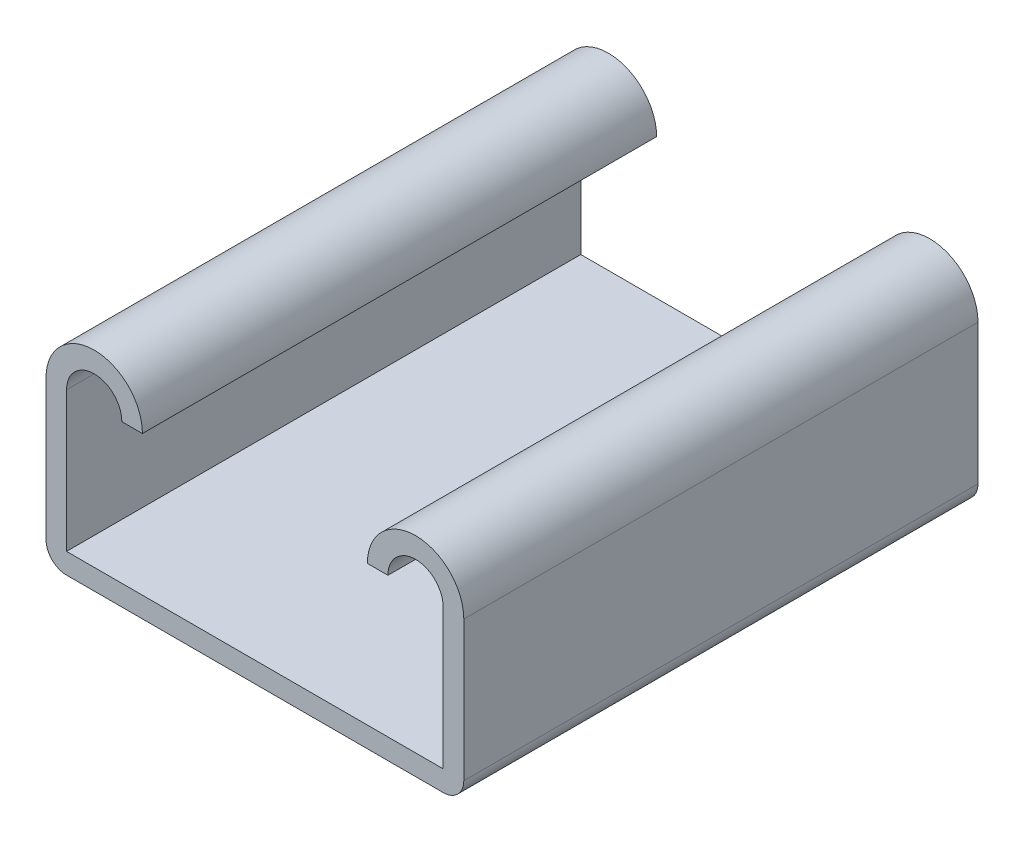
ISO-10303-21;
HEADER;
FILE_DESCRIPTION(('STEP AP214'),'2;1');
FILE_NAME('part.step','',(''),(''),'','','');
FILE_SCHEMA(('AUTOMOTIVE_DESIGN { 1 0 10303 214 1 1 1 1 }'));
ENDSEC;
DATA;
#1=APPLICATION_CONTEXT('core data for automotive mechanical design processes');
#2=APPLICATION_PROTOCOL_DEFINITION('international standard','automotive_design',2000,#1);
#3=PRODUCT_CONTEXT('',#1,'mechanical');
#4=PRODUCT('Part','Part','',(#3));
#5=PRODUCT_RELATED_PRODUCT_CATEGORY('part','',(#4));
#6=PRODUCT_DEFINITION_FORMATION('','',#4);
#7=PRODUCT_DEFINITION_CONTEXT('part definition',#1,'design');
#8=PRODUCT_DEFINITION('design','',#6,#7);
#9=PRODUCT_DEFINITION_SHAPE('','',#8);
#10=(LENGTH_UNIT() NAMED_UNIT(*) SI_UNIT(.MILLI.,.METRE.));
#11=(NAMED_UNIT(*) PLANE_ANGLE_UNIT() SI_UNIT($,.RADIAN.));
#12=(NAMED_UNIT(*) SI_UNIT($,.STERADIAN.) SOLID_ANGLE_UNIT());
#13=UNCERTAINTY_MEASURE_WITH_UNIT(LENGTH_MEASURE(1.E-05),#10,'distance_accuracy_value','');
#14=(GEOMETRIC_REPRESENTATION_CONTEXT(3) GLOBAL_UNCERTAINTY_ASSIGNED_CONTEXT((#13)) GLOBAL_UNIT_ASSIGNED_CONTEXT((#10,
#11,#12)) REPRESENTATION_CONTEXT('',''));
#15=CARTESIAN_POINT('',(0.,0.,0.));
#16=DIRECTION('',(0.,0.,1.));
#17=DIRECTION('',(1.,0.,0.));
#18=AXIS2_PLACEMENT_3D('',#15,#16,#17);
#19=CARTESIAN_POINT('',(-7.9375,3.79095,12.7));
#20=DIRECTION('',(0.,0.,-1.));
#21=DIRECTION('',(-1.,0.,0.));
#22=AXIS2_PLACEMENT_3D('',#19,#20,#21);
#23=CYLINDRICAL_SURFACE('',#22,2.38125);
#24=CARTESIAN_POINT('',(-7.9375,3.79095,-12.7));
#25=DIRECTION('',(0.,0.,1.));
#26=DIRECTION('',(-1.,0.,0.));
#27=AXIS2_PLACEMENT_3D('',#24,#25,#26);
#28=CIRCLE('',#27,2.38125);
#29=CARTESIAN_POINT('',(-5.55625,3.79095,-12.7));
#30=VERTEX_POINT('',#29);
#31=CARTESIAN_POINT('',(-10.31875,3.79095,-12.7));
#32=VERTEX_POINT('',#31);
#33=EDGE_CURVE('E164',#30,#32,#28,.T.);
#34=ORIENTED_EDGE('',*,*,#33,.T.);
#35=DIRECTION('',(0.,0.,-1.));
#36=VECTOR('',#35,1.);
#37=CARTESIAN_POINT('',(-10.31875,3.79095,12.7));
#38=LINE('',#37,#36);
#39=CARTESIAN_POINT('',(-10.31875,3.79095,12.7));
#40=VERTEX_POINT('',#39);
#41=EDGE_CURVE('E11',#40,#32,#38,.T.);
#42=ORIENTED_EDGE('',*,*,#41,.F.);
#43=CARTESIAN_POINT('',(-7.9375,3.79095,12.7));
#44=DIRECTION('',(0.,0.,1.));
#45=DIRECTION('',(-1.,0.,0.));
#46=AXIS2_PLACEMENT_3D('',#43,#44,#45);
#47=CIRCLE('',#46,2.38125);
#48=CARTESIAN_POINT('',(-5.55625,3.79095,12.7));
#49=VERTEX_POINT('',#48);
#50=EDGE_CURVE('E190',#49,#40,#47,.T.);
#51=ORIENTED_EDGE('',*,*,#50,.F.);
#52=DIRECTION('',(0.,0.,-1.));
#53=VECTOR('',#52,1.);
#54=CARTESIAN_POINT('',(-5.55625,3.79095,12.7));
#55=LINE('',#54,#53);
#56=EDGE_CURVE('E160',#49,#30,#55,.T.);
#57=ORIENTED_EDGE('',*,*,#56,.T.);
#58=EDGE_LOOP('',(#34,#42,#51,#57));
#59=FACE_BOUND('',#58,.T.);
#60=ADVANCED_FACE('F32',(#59),#23,.T.);
#61=CARTESIAN_POINT('',(-10.31875,3.79095,12.7));
#62=DIRECTION('',(1.,0.,0.));
#63=DIRECTION('',(0.,1.,0.));
#64=AXIS2_PLACEMENT_3D('',#61,#62,#63);
#65=PLANE('',#64);
#66=DIRECTION('',(0.,-1.,0.));
#67=VECTOR('',#66,1.);
#68=CARTESIAN_POINT('',(-10.31875,3.79095,-12.7));
#69=LINE('',#68,#67);
#70=CARTESIAN_POINT('',(-10.31875,-3.1242,-12.7));
#71=VERTEX_POINT('',#70);
#72=EDGE_CURVE('E167',#32,#71,#69,.T.);
#73=ORIENTED_EDGE('',*,*,#72,.T.);
#74=DIRECTION('',(0.,0.,-1.));
#75=VECTOR('',#74,1.);
#76=CARTESIAN_POINT('',(-10.31875,-3.1242,12.7));
#77=LINE('',#76,#75);
#78=CARTESIAN_POINT('',(-10.31875,-3.1242,12.7));
#79=VERTEX_POINT('',#78);
#80=EDGE_CURVE('E40',#79,#71,#77,.T.);
#81=ORIENTED_EDGE('',*,*,#80,.F.);
#82=DIRECTION('',(0.,-1.,0.));
#83=VECTOR('',#82,1.);
#84=CARTESIAN_POINT('',(-10.31875,3.79095,12.7));
#85=LINE('',#84,#83);
#86=EDGE_CURVE('E109',#40,#79,#85,.T.);
#87=ORIENTED_EDGE('',*,*,#86,.F.);
#88=ORIENTED_EDGE('',*,*,#41,.T.);
#89=EDGE_LOOP('',(#73,#81,#87,#88));
#90=FACE_BOUND('',#89,.T.);
#91=ADVANCED_FACE('F278',(#90),#65,.F.);
#92=CARTESIAN_POINT('',(-9.30275,-3.1242,12.7));
#93=DIRECTION('',(0.,0.,-1.));
#94=DIRECTION('',(-1.,0.,0.));
#95=AXIS2_PLACEMENT_3D('',#92,#93,#94);
#96=CYLINDRICAL_SURFACE('',#95,1.016);
#97=CARTESIAN_POINT('',(-9.30275,-3.1242,-12.7));
#98=DIRECTION('',(0.,0.,1.));
#99=DIRECTION('',(-1.,0.,0.));
#100=AXIS2_PLACEMENT_3D('',#97,#98,#99);
#101=CIRCLE('',#100,1.016);
#102=CARTESIAN_POINT('',(-9.30275,-4.1402,-12.7));
#103=VERTEX_POINT('',#102);
#104=EDGE_CURVE('E169',#71,#103,#101,.T.);
#105=ORIENTED_EDGE('',*,*,#104,.T.);
#106=DIRECTION('',(0.,0.,-1.));
#107=VECTOR('',#106,1.);
#108=CARTESIAN_POINT('',(-9.30275,-4.1402,12.7));
#109=LINE('',#108,#107);
#110=CARTESIAN_POINT('',(-9.30275,-4.1402,12.7));
#111=VERTEX_POINT('',#110);
#112=EDGE_CURVE('E215',#111,#103,#109,.T.);
#113=ORIENTED_EDGE('',*,*,#112,.F.);
#114=CARTESIAN_POINT('',(-9.30275,-3.1242,12.7));
#115=DIRECTION('',(0.,0.,1.));
#116=DIRECTION('',(-1.,0.,0.));
#117=AXIS2_PLACEMENT_3D('',#114,#115,#116);
#118=CIRCLE('',#117,1.016);
#119=EDGE_CURVE('E223',#79,#111,#118,.T.);
#120=ORIENTED_EDGE('',*,*,#119,.F.);
#121=ORIENTED_EDGE('',*,*,#80,.T.);
#122=EDGE_LOOP('',(#105,#113,#120,#121));
#123=FACE_BOUND('',#122,.T.);
#124=ADVANCED_FACE('F221',(#123),#96,.T.);
#125=CARTESIAN_POINT('',(-9.30275,-4.1402,12.7));
#126=DIRECTION('',(0.,1.,0.));
#127=DIRECTION('',(-1.,0.,0.));
#128=AXIS2_PLACEMENT_3D('',#125,#126,#127);
#129=PLANE('',#128);
#130=DIRECTION('',(1.,0.,0.));
#131=VECTOR('',#130,1.);
#132=CARTESIAN_POINT('',(-9.30275,-4.1402,-12.7));
#133=LINE('',#132,#131);
#134=CARTESIAN_POINT('',(9.30275,-4.1402,-12.7));
#135=VERTEX_POINT('',#134);
#136=EDGE_CURVE('E171',#103,#135,#133,.T.);
#137=ORIENTED_EDGE('',*,*,#136,.T.);
#138=DIRECTION('',(0.,0.,-1.));
#139=VECTOR('',#138,1.);
#140=CARTESIAN_POINT('',(9.30275,-4.1402,12.7));
#141=LINE('',#140,#139);
#142=CARTESIAN_POINT('',(9.30275,-4.1402,12.7));
#143=VERTEX_POINT('',#142);
#144=EDGE_CURVE('E212',#143,#135,#141,.T.);
#145=ORIENTED_EDGE('',*,*,#144,.F.);
#146=DIRECTION('',(1.,0.,0.));
#147=VECTOR('',#146,1.);
#148=CARTESIAN_POINT('',(-9.30275,-4.1402,12.7));
#149=LINE('',#148,#147);
#150=EDGE_CURVE('E241',#111,#143,#149,.T.);
#151=ORIENTED_EDGE('',*,*,#150,.F.);
#152=ORIENTED_EDGE('',*,*,#112,.T.);
#153=EDGE_LOOP('',(#137,#145,#151,#152));
#154=FACE_BOUND('',#153,.T.);
#155=ADVANCED_FACE('F232',(#154),#129,.F.);
#156=CARTESIAN_POINT('',(9.30275,-3.1242,12.7));
#157=DIRECTION('',(0.,0.,-1.));
#158=DIRECTION('',(-1.,0.,0.));
#159=AXIS2_PLACEMENT_3D('',#156,#157,#158);
#160=CYLINDRICAL_SURFACE('',#159,1.016);
#161=CARTESIAN_POINT('',(9.30275,-3.1242,-12.7));
#162=DIRECTION('',(0.,0.,1.));
#163=DIRECTION('',(1.,0.,0.));
#164=AXIS2_PLACEMENT_3D('',#161,#162,#163);
#165=CIRCLE('',#164,1.016);
#166=CARTESIAN_POINT('',(10.31875,-3.1242,-12.7));
#167=VERTEX_POINT('',#166);
#168=EDGE_CURVE('E173',#135,#167,#165,.T.);
#169=ORIENTED_EDGE('',*,*,#168,.T.);
#170=DIRECTION('',(0.,0.,-1.));
#171=VECTOR('',#170,1.);
#172=CARTESIAN_POINT('',(10.31875,-3.1242,12.7));
#173=LINE('',#172,#171);
#174=CARTESIAN_POINT('',(10.31875,-3.1242,12.7));
#175=VERTEX_POINT('',#174);
#176=EDGE_CURVE('E209',#175,#167,#173,.T.);
#177=ORIENTED_EDGE('',*,*,#176,.F.);
#178=CARTESIAN_POINT('',(9.30275,-3.1242,12.7));
#179=DIRECTION('',(0.,0.,1.));
#180=DIRECTION('',(1.,0.,0.));
#181=AXIS2_PLACEMENT_3D('',#178,#179,#180);
#182=CIRCLE('',#181,1.016);
#183=EDGE_CURVE('E238',#143,#175,#182,.T.);
#184=ORIENTED_EDGE('',*,*,#183,.F.);
#185=ORIENTED_EDGE('',*,*,#144,.T.);
#186=EDGE_LOOP('',(#169,#177,#184,#185));
#187=FACE_BOUND('',#186,.T.);
#188=ADVANCED_FACE('F236',(#187),#160,.T.);
#189=CARTESIAN_POINT('',(10.31875,-3.1242,12.7));
#190=DIRECTION('',(-1.,0.,0.));
#191=DIRECTION('',(0.,0.,1.));
#192=AXIS2_PLACEMENT_3D('',#189,#190,#191);
#193=PLANE('',#192);
#194=DIRECTION('',(0.,1.,0.));
#195=VECTOR('',#194,1.);
#196=CARTESIAN_POINT('',(10.31875,-3.1242,-12.7));
#197=LINE('',#196,#195);
#198=CARTESIAN_POINT('',(10.31875,3.79095,-12.7));
#199=VERTEX_POINT('',#198);
#200=EDGE_CURVE('E175',#167,#199,#197,.T.);
#201=ORIENTED_EDGE('',*,*,#200,.T.);
#202=DIRECTION('',(0.,0.,-1.));
#203=VECTOR('',#202,1.);
#204=CARTESIAN_POINT('',(10.31875,3.79095,12.7));
#205=LINE('',#204,#203);
#206=CARTESIAN_POINT('',(10.31875,3.79095,12.7));
#207=VERTEX_POINT('',#206);
#208=EDGE_CURVE('E206',#207,#199,#205,.T.);
#209=ORIENTED_EDGE('',*,*,#208,.F.);
#210=DIRECTION('',(0.,1.,0.));
#211=VECTOR('',#210,1.);
#212=CARTESIAN_POINT('',(10.31875,-3.1242,12.7));
#213=LINE('',#212,#211);
#214=EDGE_CURVE('E240',#175,#207,#213,.T.);
#215=ORIENTED_EDGE('',*,*,#214,.F.);
#216=ORIENTED_EDGE('',*,*,#176,.T.);
#217=EDGE_LOOP('',(#201,#209,#215,#216));
#218=FACE_BOUND('',#217,.T.);
#219=ADVANCED_FACE('F291',(#218),#193,.F.);
#220=CARTESIAN_POINT('',(7.9375,3.79095,12.7));
#221=DIRECTION('',(0.,0.,-1.));
#222=DIRECTION('',(-1.,0.,0.));
#223=AXIS2_PLACEMENT_3D('',#220,#221,#222);
#224=CYLINDRICAL_SURFACE('',#223,2.38125);
#225=CARTESIAN_POINT('',(7.9375,3.79095,-12.7));
#226=DIRECTION('',(0.,0.,1.));
#227=DIRECTION('',(1.,0.,0.));
#228=AXIS2_PLACEMENT_3D('',#225,#226,#227);
#229=CIRCLE('',#228,2.38125);
#230=CARTESIAN_POINT('',(5.55625,3.79095,-12.7));
#231=VERTEX_POINT('',#230);
#232=EDGE_CURVE('E177',#199,#231,#229,.T.);
#233=ORIENTED_EDGE('',*,*,#232,.T.);
#234=DIRECTION('',(0.,0.,-1.));
#235=VECTOR('',#234,1.);
#236=CARTESIAN_POINT('',(5.55625,3.79095,12.7));
#237=LINE('',#236,#235);
#238=CARTESIAN_POINT('',(5.55625,3.79095,12.7));
#239=VERTEX_POINT('',#238);
#240=EDGE_CURVE('E203',#239,#231,#237,.T.);
#241=ORIENTED_EDGE('',*,*,#240,.F.);
#242=CARTESIAN_POINT('',(7.9375,3.79095,12.7));
#243=DIRECTION('',(0.,0.,1.));
#244=DIRECTION('',(1.,0.,0.));
#245=AXIS2_PLACEMENT_3D('',#242,#243,#244);
#246=CIRCLE('',#245,2.38125);
#247=EDGE_CURVE('E243',#207,#239,#246,.T.);
#248=ORIENTED_EDGE('',*,*,#247,.F.);
#249=ORIENTED_EDGE('',*,*,#208,.T.);
#250=EDGE_LOOP('',(#233,#241,#248,#249));
#251=FACE_BOUND('',#250,.T.);
#252=ADVANCED_FACE('F294',(#251),#224,.T.);
#253=CARTESIAN_POINT('',(5.55625,3.79095,12.7));
#254=DIRECTION('',(0.,1.,0.));
#255=DIRECTION('',(-1.,0.,0.));
#256=AXIS2_PLACEMENT_3D('',#253,#254,#255);
#257=PLANE('',#256);
#258=DIRECTION('',(1.,0.,0.));
#259=VECTOR('',#258,1.);
#260=CARTESIAN_POINT('',(5.55625,3.79095,-12.7));
#261=LINE('',#260,#259);
#262=CARTESIAN_POINT('',(6.57225,3.79095,-12.7));
#263=VERTEX_POINT('',#262);
#264=EDGE_CURVE('E179',#231,#263,#261,.T.);
#265=ORIENTED_EDGE('',*,*,#264,.T.);
#266=DIRECTION('',(0.,0.,-1.));
#267=VECTOR('',#266,1.);
#268=CARTESIAN_POINT('',(6.57225,3.79095,12.7));
#269=LINE('',#268,#267);
#270=CARTESIAN_POINT('',(6.57225,3.79095,12.7));
#271=VERTEX_POINT('',#270);
#272=EDGE_CURVE('E200',#271,#263,#269,.T.);
#273=ORIENTED_EDGE('',*,*,#272,.F.);
#274=DIRECTION('',(1.,0.,0.));
#275=VECTOR('',#274,1.);
#276=CARTESIAN_POINT('',(5.55625,3.79095,12.7));
#277=LINE('',#276,#275);
#278=EDGE_CURVE('E249',#239,#271,#277,.T.);
#279=ORIENTED_EDGE('',*,*,#278,.F.);
#280=ORIENTED_EDGE('',*,*,#240,.T.);
#281=EDGE_LOOP('',(#265,#273,#279,#280));
#282=FACE_BOUND('',#281,.T.);
#283=ADVANCED_FACE('F298',(#282),#257,.F.);
#284=CARTESIAN_POINT('',(7.9375,3.79095,12.7));
#285=DIRECTION('',(0.,0.,-1.));
#286=DIRECTION('',(-1.,0.,0.));
#287=AXIS2_PLACEMENT_3D('',#284,#285,#286);
#288=CYLINDRICAL_SURFACE('',#287,1.36525);
#289=CARTESIAN_POINT('',(7.9375,3.79095,-12.7));
#290=DIRECTION('',(0.,0.,-1.));
#291=DIRECTION('',(1.,0.,0.));
#292=AXIS2_PLACEMENT_3D('',#289,#290,#291);
#293=CIRCLE('',#292,1.36525);
#294=CARTESIAN_POINT('',(9.30275,3.79095,-12.7));
#295=VERTEX_POINT('',#294);
#296=EDGE_CURVE('E181',#263,#295,#293,.T.);
#297=ORIENTED_EDGE('',*,*,#296,.T.);
#298=DIRECTION('',(0.,0.,-1.));
#299=VECTOR('',#298,1.);
#300=CARTESIAN_POINT('',(9.30275,3.79095,12.7));
#301=LINE('',#300,#299);
#302=CARTESIAN_POINT('',(9.30275,3.79095,12.7));
#303=VERTEX_POINT('',#302);
#304=EDGE_CURVE('E197',#303,#295,#301,.T.);
#305=ORIENTED_EDGE('',*,*,#304,.F.);
#306=CARTESIAN_POINT('',(7.9375,3.79095,12.7));
#307=DIRECTION('',(0.,0.,-1.));
#308=DIRECTION('',(1.,0.,0.));
#309=AXIS2_PLACEMENT_3D('',#306,#307,#308);
#310=CIRCLE('',#309,1.36525);
#311=EDGE_CURVE('E251',#271,#303,#310,.T.);
#312=ORIENTED_EDGE('',*,*,#311,.F.);
#313=ORIENTED_EDGE('',*,*,#272,.T.);
#314=EDGE_LOOP('',(#297,#305,#312,#313));
#315=FACE_BOUND('',#314,.T.);
#316=ADVANCED_FACE('F302',(#315),#288,.F.);
#317=CARTESIAN_POINT('',(9.30275,-3.1242,12.7));
#318=DIRECTION('',(1.,0.,0.));
#319=DIRECTION('',(0.,1.,0.));
#320=AXIS2_PLACEMENT_3D('',#317,#318,#319);
#321=PLANE('',#320);
#322=DIRECTION('',(0.,-1.,0.));
#323=VECTOR('',#322,1.);
#324=CARTESIAN_POINT('',(9.30275,-3.1242,-12.7));
#325=LINE('',#324,#323);
#326=CARTESIAN_POINT('',(9.30275,-3.1242,-12.7));
#327=VERTEX_POINT('',#326);
#328=EDGE_CURVE('E183',#295,#327,#325,.T.);
#329=ORIENTED_EDGE('',*,*,#328,.T.);
#330=DIRECTION('',(0.,0.,-1.));
#331=VECTOR('',#330,1.);
#332=CARTESIAN_POINT('',(9.30275,-3.1242,12.7));
#333=LINE('',#332,#331);
#334=CARTESIAN_POINT('',(9.30275,-3.1242,12.7));
#335=VERTEX_POINT('',#334);
#336=EDGE_CURVE('E194',#335,#327,#333,.T.);
#337=ORIENTED_EDGE('',*,*,#336,.F.);
#338=DIRECTION('',(0.,-1.,0.));
#339=VECTOR('',#338,1.);
#340=CARTESIAN_POINT('',(9.30275,-3.1242,12.7));
#341=LINE('',#340,#339);
#342=EDGE_CURVE('E253',#303,#335,#341,.T.);
#343=ORIENTED_EDGE('',*,*,#342,.F.);
#344=ORIENTED_EDGE('',*,*,#304,.T.);
#345=EDGE_LOOP('',(#329,#337,#343,#344));
#346=FACE_BOUND('',#345,.T.);
#347=ADVANCED_FACE('F259',(#346),#321,.F.);
#348=CARTESIAN_POINT('',(-9.30275,-3.1242,12.7));
#349=DIRECTION('',(0.,-1.,0.));
#350=DIRECTION('',(0.,0.,-1.));
#351=AXIS2_PLACEMENT_3D('',#348,#349,#350);
#352=PLANE('',#351);
#353=DIRECTION('',(-1.,0.,0.));
#354=VECTOR('',#353,1.);
#355=CARTESIAN_POINT('',(-9.30275,-3.1242,-12.7));
#356=LINE('',#355,#354);
#357=CARTESIAN_POINT('',(-9.30275,-3.1242,-12.7));
#358=VERTEX_POINT('',#357);
#359=EDGE_CURVE('E185',#327,#358,#356,.T.);
#360=ORIENTED_EDGE('',*,*,#359,.T.);
#361=DIRECTION('',(0.,0.,-1.));
#362=VECTOR('',#361,1.);
#363=CARTESIAN_POINT('',(-9.30275,-3.1242,12.7));
#364=LINE('',#363,#362);
#365=CARTESIAN_POINT('',(-9.30275,-3.1242,12.7));
#366=VERTEX_POINT('',#365);
#367=EDGE_CURVE('E155',#366,#358,#364,.T.);
#368=ORIENTED_EDGE('',*,*,#367,.F.);
#369=DIRECTION('',(-1.,0.,0.));
#370=VECTOR('',#369,1.);
#371=CARTESIAN_POINT('',(-9.30275,-3.1242,12.7));
#372=LINE('',#371,#370);
#373=EDGE_CURVE('E146',#335,#366,#372,.T.);
#374=ORIENTED_EDGE('',*,*,#373,.F.);
#375=ORIENTED_EDGE('',*,*,#336,.T.);
#376=EDGE_LOOP('',(#360,#368,#374,#375));
#377=FACE_BOUND('',#376,.T.);
#378=ADVANCED_FACE('F263',(#377),#352,.F.);
#379=CARTESIAN_POINT('',(-9.30275,3.79095,12.7));
#380=DIRECTION('',(-1.,0.,0.));
#381=DIRECTION('',(0.,-1.,0.));
#382=AXIS2_PLACEMENT_3D('',#379,#380,#381);
#383=PLANE('',#382);
#384=DIRECTION('',(0.,1.,0.));
#385=VECTOR('',#384,1.);
#386=CARTESIAN_POINT('',(-9.30275,3.79095,-12.7));
#387=LINE('',#386,#385);
#388=CARTESIAN_POINT('',(-9.30275,3.79095,-12.7));
#389=VERTEX_POINT('',#388);
#390=EDGE_CURVE('E154',#358,#389,#387,.T.);
#391=ORIENTED_EDGE('',*,*,#390,.T.);
#392=DIRECTION('',(0.,0.,-1.));
#393=VECTOR('',#392,1.);
#394=CARTESIAN_POINT('',(-9.30275,3.79095,12.7));
#395=LINE('',#394,#393);
#396=CARTESIAN_POINT('',(-9.30275,3.79095,12.7));
#397=VERTEX_POINT('',#396);
#398=EDGE_CURVE('E151',#397,#389,#395,.T.);
#399=ORIENTED_EDGE('',*,*,#398,.F.);
#400=DIRECTION('',(0.,1.,0.));
#401=VECTOR('',#400,1.);
#402=CARTESIAN_POINT('',(-9.30275,3.79095,12.7));
#403=LINE('',#402,#401);
#404=EDGE_CURVE('E140',#366,#397,#403,.T.);
#405=ORIENTED_EDGE('',*,*,#404,.F.);
#406=ORIENTED_EDGE('',*,*,#367,.T.);
#407=EDGE_LOOP('',(#391,#399,#405,#406));
#408=FACE_BOUND('',#407,.T.);
#409=ADVANCED_FACE('F152',(#408),#383,.F.);
#410=CARTESIAN_POINT('',(-7.9375,3.79095,12.7));
#411=DIRECTION('',(0.,0.,-1.));
#412=DIRECTION('',(-1.,0.,0.));
#413=AXIS2_PLACEMENT_3D('',#410,#411,#412);
#414=CYLINDRICAL_SURFACE('',#413,1.36525);
#415=CARTESIAN_POINT('',(-7.9375,3.79095,-12.7));
#416=DIRECTION('',(0.,0.,-1.));
#417=DIRECTION('',(-1.,0.,0.));
#418=AXIS2_PLACEMENT_3D('',#415,#416,#417);
#419=CIRCLE('',#418,1.36525);
#420=CARTESIAN_POINT('',(-6.57225,3.79095,-12.7));
#421=VERTEX_POINT('',#420);
#422=EDGE_CURVE('E95',#389,#421,#419,.T.);
#423=ORIENTED_EDGE('',*,*,#422,.T.);
#424=DIRECTION('',(0.,0.,-1.));
#425=VECTOR('',#424,1.);
#426=CARTESIAN_POINT('',(-6.57225,3.79095,12.7));
#427=LINE('',#426,#425);
#428=CARTESIAN_POINT('',(-6.57225,3.79095,12.7));
#429=VERTEX_POINT('',#428);
#430=EDGE_CURVE('E156',#429,#421,#427,.T.);
#431=ORIENTED_EDGE('',*,*,#430,.F.);
#432=CARTESIAN_POINT('',(-7.9375,3.79095,12.7));
#433=DIRECTION('',(0.,0.,-1.));
#434=DIRECTION('',(-1.,0.,0.));
#435=AXIS2_PLACEMENT_3D('',#432,#433,#434);
#436=CIRCLE('',#435,1.36525);
#437=EDGE_CURVE('E144',#397,#429,#436,.T.);
#438=ORIENTED_EDGE('',*,*,#437,.F.);
#439=ORIENTED_EDGE('',*,*,#398,.T.);
#440=EDGE_LOOP('',(#423,#431,#438,#439));
#441=FACE_BOUND('',#440,.T.);
#442=ADVANCED_FACE('F158',(#441),#414,.F.);
#443=CARTESIAN_POINT('',(-6.57225,3.79095,12.7));
#444=DIRECTION('',(0.,1.,0.));
#445=DIRECTION('',(0.,0.,1.));
#446=AXIS2_PLACEMENT_3D('',#443,#444,#445);
#447=PLANE('',#446);
#448=DIRECTION('',(1.,0.,0.));
#449=VECTOR('',#448,1.);
#450=CARTESIAN_POINT('',(-6.57225,3.79095,-12.7));
#451=LINE('',#450,#449);
#452=EDGE_CURVE('E101',#421,#30,#451,.T.);
#453=ORIENTED_EDGE('',*,*,#452,.T.);
#454=ORIENTED_EDGE('',*,*,#56,.F.);
#455=DIRECTION('',(1.,0.,0.));
#456=VECTOR('',#455,1.);
#457=CARTESIAN_POINT('',(-6.57225,3.79095,12.7));
#458=LINE('',#457,#456);
#459=EDGE_CURVE('E48',#429,#49,#458,.T.);
#460=ORIENTED_EDGE('',*,*,#459,.F.);
#461=ORIENTED_EDGE('',*,*,#430,.T.);
#462=EDGE_LOOP('',(#453,#454,#460,#461));
#463=FACE_BOUND('',#462,.T.);
#464=ADVANCED_FACE('F267',(#463),#447,.F.);
#465=CARTESIAN_POINT('',(-7.9375,3.79095,12.7));
#466=DIRECTION('',(0.,0.,-1.));
#467=DIRECTION('',(-1.,0.,0.));
#468=AXIS2_PLACEMENT_3D('',#465,#466,#467);
#469=PLANE('',#468);
#470=ORIENTED_EDGE('',*,*,#50,.T.);
#471=ORIENTED_EDGE('',*,*,#86,.T.);
#472=ORIENTED_EDGE('',*,*,#119,.T.);
#473=ORIENTED_EDGE('',*,*,#150,.T.);
#474=ORIENTED_EDGE('',*,*,#183,.T.);
#475=ORIENTED_EDGE('',*,*,#214,.T.);
#476=ORIENTED_EDGE('',*,*,#247,.T.);
#477=ORIENTED_EDGE('',*,*,#278,.T.);
#478=ORIENTED_EDGE('',*,*,#311,.T.);
#479=ORIENTED_EDGE('',*,*,#342,.T.);
#480=ORIENTED_EDGE('',*,*,#373,.T.);
#481=ORIENTED_EDGE('',*,*,#404,.T.);
#482=ORIENTED_EDGE('',*,*,#437,.T.);
#483=ORIENTED_EDGE('',*,*,#459,.T.);
#484=EDGE_LOOP('',(#470,#471,#472,#473,#474,#475,#476,#477,#478,#479,#480,#481,#482,#483));
#485=FACE_BOUND('',#484,.T.);
#486=ADVANCED_FACE('F142',(#485),#469,.F.);
#487=CARTESIAN_POINT('',(-7.9375,3.79095,-12.7));
#488=DIRECTION('',(0.,0.,-1.));
#489=DIRECTION('',(-1.,0.,0.));
#490=AXIS2_PLACEMENT_3D('',#487,#488,#489);
#491=PLANE('',#490);
#492=ORIENTED_EDGE('',*,*,#33,.F.);
#493=ORIENTED_EDGE('',*,*,#452,.F.);
#494=ORIENTED_EDGE('',*,*,#422,.F.);
#495=ORIENTED_EDGE('',*,*,#390,.F.);
#496=ORIENTED_EDGE('',*,*,#359,.F.);
#497=ORIENTED_EDGE('',*,*,#328,.F.);
#498=ORIENTED_EDGE('',*,*,#296,.F.);
#499=ORIENTED_EDGE('',*,*,#264,.F.);
#500=ORIENTED_EDGE('',*,*,#232,.F.);
#501=ORIENTED_EDGE('',*,*,#200,.F.);
#502=ORIENTED_EDGE('',*,*,#168,.F.);
#503=ORIENTED_EDGE('',*,*,#136,.F.);
#504=ORIENTED_EDGE('',*,*,#104,.F.);
#505=ORIENTED_EDGE('',*,*,#72,.F.);
#506=EDGE_LOOP('',(#492,#493,#494,#495,#496,#497,#498,#499,#500,#501,#502,#503,#504,#505));
#507=FACE_BOUND('',#506,.T.);
#508=ADVANCED_FACE('F227',(#507),#491,.T.);
#509=CLOSED_SHELL('',(#60,#91,#124,#155,#188,#219,#252,#283,#316,#347,#378,#409,#442,#464,#486,#508));
#510=MANIFOLD_SOLID_BREP('B2',#509);
#511=ADVANCED_BREP_SHAPE_REPRESENTATION('',(#18,#510),#14);
#512=SHAPE_DEFINITION_REPRESENTATION(#9,#511);
ENDSEC;
END-ISO-10303-21;
